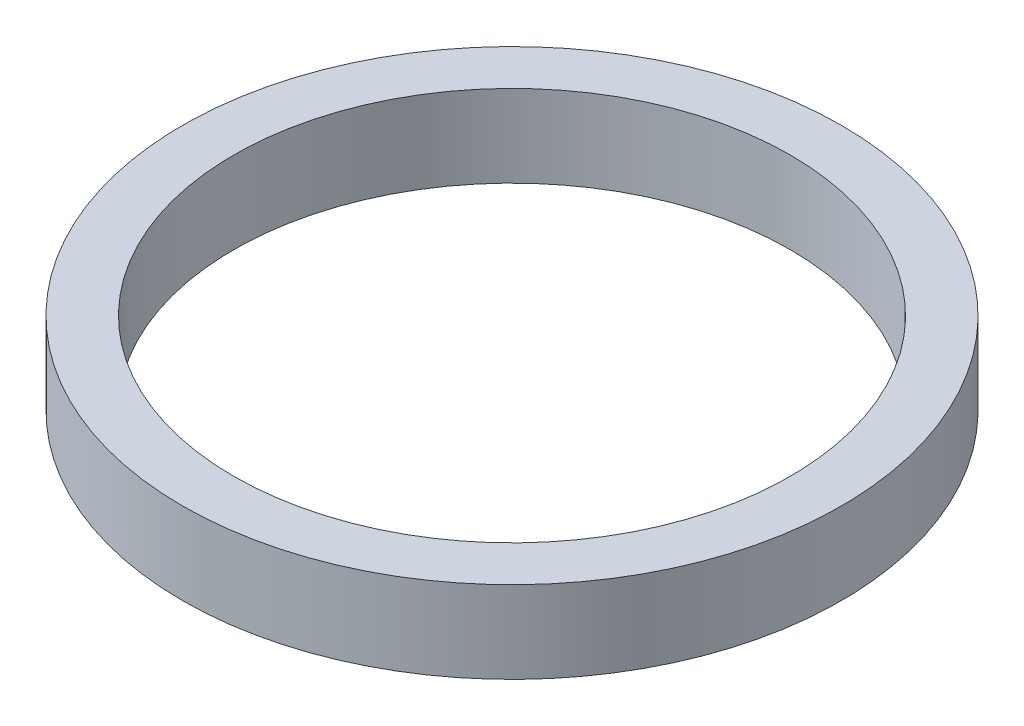
ISO-10303-21;
HEADER;
FILE_DESCRIPTION(('STEP AP214'),'2;1');
FILE_NAME('part.step','',(''),(''),'','','');
FILE_SCHEMA(('AUTOMOTIVE_DESIGN { 1 0 10303 214 1 1 1 1 }'));
ENDSEC;
DATA;
#1=APPLICATION_CONTEXT('core data for automotive mechanical design processes');
#2=APPLICATION_PROTOCOL_DEFINITION('international standard','automotive_design',2000,#1);
#3=PRODUCT_CONTEXT('',#1,'mechanical');
#4=PRODUCT('Part','Part','',(#3));
#5=PRODUCT_RELATED_PRODUCT_CATEGORY('part','',(#4));
#6=PRODUCT_DEFINITION_FORMATION('','',#4);
#7=PRODUCT_DEFINITION_CONTEXT('part definition',#1,'design');
#8=PRODUCT_DEFINITION('design','',#6,#7);
#9=PRODUCT_DEFINITION_SHAPE('','',#8);
#10=(LENGTH_UNIT() NAMED_UNIT(*) SI_UNIT(.MILLI.,.METRE.));
#11=(NAMED_UNIT(*) PLANE_ANGLE_UNIT() SI_UNIT($,.RADIAN.));
#12=(NAMED_UNIT(*) SI_UNIT($,.STERADIAN.) SOLID_ANGLE_UNIT());
#13=UNCERTAINTY_MEASURE_WITH_UNIT(LENGTH_MEASURE(1.E-05),#10,'distance_accuracy_value','');
#14=(GEOMETRIC_REPRESENTATION_CONTEXT(3) GLOBAL_UNCERTAINTY_ASSIGNED_CONTEXT((#13)) GLOBAL_UNIT_ASSIGNED_CONTEXT((#10,
#11,#12)) REPRESENTATION_CONTEXT('',''));
#15=CARTESIAN_POINT('',(0.,0.,0.));
#16=DIRECTION('',(0.,0.,1.));
#17=DIRECTION('',(1.,0.,0.));
#18=AXIS2_PLACEMENT_3D('',#15,#16,#17);
#19=CARTESIAN_POINT('',(-22.5,0.,0.));
#20=DIRECTION('',(0.,1.,0.));
#21=DIRECTION('',(0.,0.,1.));
#22=AXIS2_PLACEMENT_3D('',#19,#20,#21);
#23=PLANE('',#22);
#24=CARTESIAN_POINT('',(0.,0.,0.));
#25=DIRECTION('',(0.,-1.,0.));
#26=DIRECTION('',(0.,0.,-1.));
#27=AXIS2_PLACEMENT_3D('',#24,#25,#26);
#28=CIRCLE('',#27,19.);
#29=CARTESIAN_POINT('',(0.,0.,-19.));
#30=VERTEX_POINT('',#29);
#31=EDGE_CURVE('E10',#30,#30,#28,.T.);
#32=ORIENTED_EDGE('',*,*,#31,.F.);
#33=EDGE_LOOP('',(#32));
#34=FACE_BOUND('',#33,.T.);
#35=CARTESIAN_POINT('',(0.,0.,0.));
#36=DIRECTION('',(0.,-1.,0.));
#37=DIRECTION('',(0.,0.,-1.));
#38=AXIS2_PLACEMENT_3D('',#35,#36,#37);
#39=CIRCLE('',#38,22.5);
#40=CARTESIAN_POINT('',(0.,0.,-22.5));
#41=VERTEX_POINT('',#40);
#42=EDGE_CURVE('E49',#41,#41,#39,.T.);
#43=ORIENTED_EDGE('',*,*,#42,.T.);
#44=EDGE_LOOP('',(#43));
#45=FACE_BOUND('',#44,.T.);
#46=ADVANCED_FACE('F35',(#34,#45),#23,.F.);
#47=CARTESIAN_POINT('',(0.,-6.67441860465116,0.));
#48=DIRECTION('',(0.,-1.,0.));
#49=DIRECTION('',(0.,0.,-1.));
#50=AXIS2_PLACEMENT_3D('',#47,#48,#49);
#51=CYLINDRICAL_SURFACE('',#50,19.);
#52=CARTESIAN_POINT('',(0.,5.6,0.));
#53=DIRECTION('',(0.,-1.,0.));
#54=DIRECTION('',(0.,0.,-1.));
#55=AXIS2_PLACEMENT_3D('',#52,#53,#54);
#56=CIRCLE('',#55,19.);
#57=CARTESIAN_POINT('',(0.,5.6,-19.));
#58=VERTEX_POINT('',#57);
#59=EDGE_CURVE('E41',#58,#58,#56,.T.);
#60=ORIENTED_EDGE('',*,*,#59,.F.);
#61=EDGE_LOOP('',(#60));
#62=FACE_BOUND('',#61,.T.);
#63=ORIENTED_EDGE('',*,*,#31,.T.);
#64=EDGE_LOOP('',(#63));
#65=FACE_BOUND('',#64,.T.);
#66=ADVANCED_FACE('F64',(#62,#65),#51,.F.);
#67=CARTESIAN_POINT('',(-19.,5.6,0.));
#68=DIRECTION('',(0.,-1.,0.));
#69=DIRECTION('',(0.,0.,-1.));
#70=AXIS2_PLACEMENT_3D('',#67,#68,#69);
#71=PLANE('',#70);
#72=CARTESIAN_POINT('',(0.,5.6,0.));
#73=DIRECTION('',(0.,-1.,0.));
#74=DIRECTION('',(0.,0.,-1.));
#75=AXIS2_PLACEMENT_3D('',#72,#73,#74);
#76=CIRCLE('',#75,22.5);
#77=CARTESIAN_POINT('',(0.,5.6,-22.5));
#78=VERTEX_POINT('',#77);
#79=EDGE_CURVE('E45',#78,#78,#76,.T.);
#80=ORIENTED_EDGE('',*,*,#79,.F.);
#81=EDGE_LOOP('',(#80));
#82=FACE_BOUND('',#81,.T.);
#83=ORIENTED_EDGE('',*,*,#59,.T.);
#84=EDGE_LOOP('',(#83));
#85=FACE_BOUND('',#84,.T.);
#86=ADVANCED_FACE('F59',(#82,#85),#71,.F.);
#87=CARTESIAN_POINT('',(0.,-6.67441860465116,0.));
#88=DIRECTION('',(0.,-1.,0.));
#89=DIRECTION('',(0.,0.,-1.));
#90=AXIS2_PLACEMENT_3D('',#87,#88,#89);
#91=CYLINDRICAL_SURFACE('',#90,22.5);
#92=ORIENTED_EDGE('',*,*,#42,.F.);
#93=EDGE_LOOP('',(#92));
#94=FACE_BOUND('',#93,.T.);
#95=ORIENTED_EDGE('',*,*,#79,.T.);
#96=EDGE_LOOP('',(#95));
#97=FACE_BOUND('',#96,.T.);
#98=ADVANCED_FACE('F56',(#94,#97),#91,.T.);
#99=CLOSED_SHELL('',(#46,#66,#86,#98));
#100=MANIFOLD_SOLID_BREP('B2',#99);
#101=ADVANCED_BREP_SHAPE_REPRESENTATION('',(#18,#100),#14);
#102=SHAPE_DEFINITION_REPRESENTATION(#9,#101);
ENDSEC;
END-ISO-10303-21;
